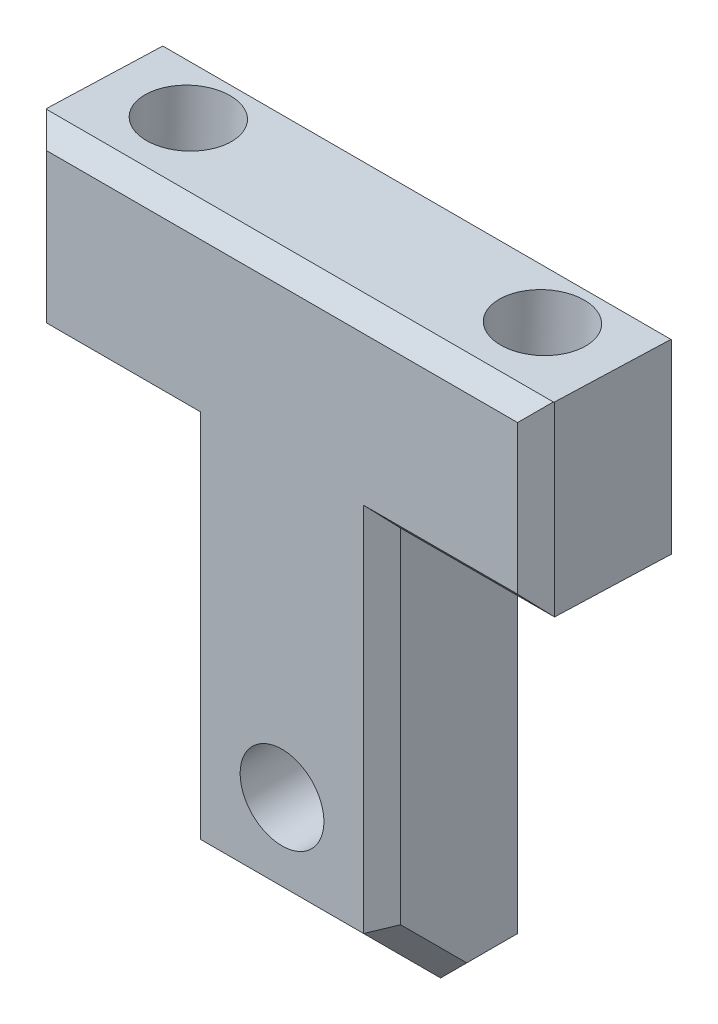
ISO-10303-21;
HEADER;
FILE_DESCRIPTION(('STEP AP214'),'2;1');
FILE_NAME('part.step','',(''),(''),'','','');
FILE_SCHEMA(('AUTOMOTIVE_DESIGN { 1 0 10303 214 1 1 1 1 }'));
ENDSEC;
DATA;
#1=APPLICATION_CONTEXT('core data for automotive mechanical design processes');
#2=APPLICATION_PROTOCOL_DEFINITION('international standard','automotive_design',2000,#1);
#3=PRODUCT_CONTEXT('',#1,'mechanical');
#4=PRODUCT('Part','Part','',(#3));
#5=PRODUCT_RELATED_PRODUCT_CATEGORY('part','',(#4));
#6=PRODUCT_DEFINITION_FORMATION('','',#4);
#7=PRODUCT_DEFINITION_CONTEXT('part definition',#1,'design');
#8=PRODUCT_DEFINITION('design','',#6,#7);
#9=PRODUCT_DEFINITION_SHAPE('','',#8);
#10=(LENGTH_UNIT() NAMED_UNIT(*) SI_UNIT(.MILLI.,.METRE.));
#11=(NAMED_UNIT(*) PLANE_ANGLE_UNIT() SI_UNIT($,.RADIAN.));
#12=(NAMED_UNIT(*) SI_UNIT($,.STERADIAN.) SOLID_ANGLE_UNIT());
#13=UNCERTAINTY_MEASURE_WITH_UNIT(LENGTH_MEASURE(1.E-05),#10,'distance_accuracy_value','');
#14=(GEOMETRIC_REPRESENTATION_CONTEXT(3) GLOBAL_UNCERTAINTY_ASSIGNED_CONTEXT((#13)) GLOBAL_UNIT_ASSIGNED_CONTEXT((#10,
#11,#12)) REPRESENTATION_CONTEXT('',''));
#15=CARTESIAN_POINT('',(0.,0.,0.));
#16=DIRECTION('',(0.,0.,1.));
#17=DIRECTION('',(1.,0.,0.));
#18=AXIS2_PLACEMENT_3D('',#15,#16,#17);
#19=CARTESIAN_POINT('',(-53.3886087756534,-22.225,6.35));
#20=DIRECTION('',(-1.,0.,0.));
#21=DIRECTION('',(0.,0.,1.));
#22=AXIS2_PLACEMENT_3D('',#19,#20,#21);
#23=PLANE('',#22);
#24=DIRECTION('',(0.,0.0343762121290854,0.999408963357672));
#25=VECTOR('',#24,1.);
#26=CARTESIAN_POINT('',(-53.3886087756534,-4.75687203963886,0.163619947690041));
#27=LINE('',#26,#25);
#28=CARTESIAN_POINT('',(-53.3886087756534,-4.73628983518983,0.761999999999995));
#29=VERTEX_POINT('',#28);
#30=CARTESIAN_POINT('',(-53.3886087756534,-4.57029212472544,5.588));
#31=VERTEX_POINT('',#30);
#32=EDGE_CURVE('E231',#29,#31,#27,.T.);
#33=ORIENTED_EDGE('',*,*,#32,.T.);
#34=DIRECTION('',(0.,-1.,0.));
#35=VECTOR('',#34,1.);
#36=CARTESIAN_POINT('',(-53.3886087756534,-22.225,5.588));
#37=LINE('',#36,#35);
#38=CARTESIAN_POINT('',(-53.3886087756534,-18.7343692654717,5.588));
#39=VERTEX_POINT('',#38);
#40=EDGE_CURVE('E328',#31,#39,#37,.T.);
#41=ORIENTED_EDGE('',*,*,#40,.T.);
#42=DIRECTION('',(0.,-0.707106781186546,-0.707106781186549));
#43=VECTOR('',#42,1.);
#44=CARTESIAN_POINT('',(-53.3886087756534,-21.6861846327359,2.63618463273585));
#45=LINE('',#44,#43);
#46=CARTESIAN_POINT('',(-53.3886087756534,-21.463,2.8593692654717));
#47=VERTEX_POINT('',#46);
#48=EDGE_CURVE('E326',#39,#47,#45,.T.);
#49=ORIENTED_EDGE('',*,*,#48,.T.);
#50=DIRECTION('',(0.,0.,-1.));
#51=VECTOR('',#50,1.);
#52=CARTESIAN_POINT('',(-53.3886087756534,-21.463,6.35));
#53=LINE('',#52,#51);
#54=CARTESIAN_POINT('',(-53.3886087756534,-21.463,0.761999999999995));
#55=VERTEX_POINT('',#54);
#56=EDGE_CURVE('E324',#47,#55,#53,.T.);
#57=ORIENTED_EDGE('',*,*,#56,.T.);
#58=DIRECTION('',(0.,1.,0.));
#59=VECTOR('',#58,1.);
#60=CARTESIAN_POINT('',(-53.3886087756534,-4.7625,0.761999999999995));
#61=LINE('',#60,#59);
#62=EDGE_CURVE('E322',#55,#29,#61,.T.);
#63=ORIENTED_EDGE('',*,*,#62,.T.);
#64=EDGE_LOOP('',(#33,#41,#49,#57,#63));
#65=FACE_BOUND('',#64,.T.);
#66=ADVANCED_FACE('F35',(#65),#23,.F.);
#67=CARTESIAN_POINT('',(-61.6436087756534,-22.225,6.35));
#68=DIRECTION('',(1.,0.,0.));
#69=DIRECTION('',(0.,0.,-1.));
#70=AXIS2_PLACEMENT_3D('',#67,#68,#69);
#71=PLANE('',#70);
#72=DIRECTION('',(0.,0.707106781186546,0.707106781186549));
#73=VECTOR('',#72,1.);
#74=CARTESIAN_POINT('',(-61.6436087756534,-18.5111846327359,5.81118463273585));
#75=LINE('',#74,#73);
#76=CARTESIAN_POINT('',(-61.6436087756534,-21.463,2.8593692654717));
#77=VERTEX_POINT('',#76);
#78=CARTESIAN_POINT('',(-61.6436087756534,-18.7343692654717,5.588));
#79=VERTEX_POINT('',#78);
#80=EDGE_CURVE('E318',#77,#79,#75,.T.);
#81=ORIENTED_EDGE('',*,*,#80,.T.);
#82=DIRECTION('',(0.,1.,0.));
#83=VECTOR('',#82,1.);
#84=CARTESIAN_POINT('',(-61.6436087756534,-22.225,5.588));
#85=LINE('',#84,#83);
#86=CARTESIAN_POINT('',(-61.6436087756534,-4.54408195991527,5.588));
#87=VERTEX_POINT('',#86);
#88=EDGE_CURVE('E320',#79,#87,#85,.T.);
#89=ORIENTED_EDGE('',*,*,#88,.T.);
#90=DIRECTION('',(0.,0.707106781186549,0.707106781186546));
#91=VECTOR('',#90,1.);
#92=CARTESIAN_POINT('',(-61.6436087756534,-13.0035409799577,-2.87145902004236));
#93=LINE('',#92,#91);
#94=CARTESIAN_POINT('',(-61.6436087756534,-4.57122577820436,5.56085618171092));
#95=VERTEX_POINT('',#94);
#96=EDGE_CURVE('E340',#87,#95,#93,.F.);
#97=ORIENTED_EDGE('',*,*,#96,.T.);
#98=DIRECTION('',(0.,-0.0343762121290854,-0.999408963357672));
#99=VECTOR('',#98,1.);
#100=CARTESIAN_POINT('',(-61.6436087756534,-4.7625,0.));
#101=LINE('',#100,#99);
#102=CARTESIAN_POINT('',(-61.6436087756534,-4.73628983518983,0.761999999999995));
#103=VERTEX_POINT('',#102);
#104=EDGE_CURVE('E225',#95,#103,#101,.T.);
#105=ORIENTED_EDGE('',*,*,#104,.T.);
#106=DIRECTION('',(0.,-1.,0.));
#107=VECTOR('',#106,1.);
#108=CARTESIAN_POINT('',(-61.6436087756534,-22.225,0.761999999999995));
#109=LINE('',#108,#107);
#110=CARTESIAN_POINT('',(-61.6436087756534,-21.463,0.761999999999995));
#111=VERTEX_POINT('',#110);
#112=EDGE_CURVE('E314',#103,#111,#109,.T.);
#113=ORIENTED_EDGE('',*,*,#112,.T.);
#114=DIRECTION('',(0.,0.,1.));
#115=VECTOR('',#114,1.);
#116=CARTESIAN_POINT('',(-61.6436087756534,-21.463,6.35));
#117=LINE('',#116,#115);
#118=EDGE_CURVE('E316',#111,#77,#117,.T.);
#119=ORIENTED_EDGE('',*,*,#118,.T.);
#120=EDGE_LOOP('',(#81,#89,#97,#105,#113,#119));
#121=FACE_BOUND('',#120,.T.);
#122=ADVANCED_FACE('F512',(#121),#71,.F.);
#123=CARTESIAN_POINT('',(-61.6436087756534,-22.225,6.35));
#124=DIRECTION('',(0.,1.,0.));
#125=DIRECTION('',(0.,0.,1.));
#126=AXIS2_PLACEMENT_3D('',#123,#124,#125);
#127=PLANE('',#126);
#128=DIRECTION('',(1.,0.,0.));
#129=VECTOR('',#128,1.);
#130=CARTESIAN_POINT('',(-53.3886087756534,-22.225,0.761999999999995));
#131=LINE('',#130,#129);
#132=CARTESIAN_POINT('',(-60.8816087756534,-22.225,0.761999999999995));
#133=VERTEX_POINT('',#132);
#134=CARTESIAN_POINT('',(-54.1506087756534,-22.225,0.761999999999995));
#135=VERTEX_POINT('',#134);
#136=EDGE_CURVE('E334',#133,#135,#131,.T.);
#137=ORIENTED_EDGE('',*,*,#136,.T.);
#138=DIRECTION('',(0.,0.,1.));
#139=VECTOR('',#138,1.);
#140=CARTESIAN_POINT('',(-54.1506087756534,-22.225,6.35));
#141=LINE('',#140,#139);
#142=CARTESIAN_POINT('',(-54.1506087756534,-22.225,3.17499999999999));
#143=VERTEX_POINT('',#142);
#144=EDGE_CURVE('E338',#135,#143,#141,.T.);
#145=ORIENTED_EDGE('',*,*,#144,.T.);
#146=DIRECTION('',(-1.,0.,0.));
#147=VECTOR('',#146,1.);
#148=CARTESIAN_POINT('',(-61.6436087756534,-22.225,3.17499999999999));
#149=LINE('',#148,#147);
#150=CARTESIAN_POINT('',(-60.8816087756534,-22.225,3.17499999999999));
#151=VERTEX_POINT('',#150);
#152=EDGE_CURVE('E253',#143,#151,#149,.T.);
#153=ORIENTED_EDGE('',*,*,#152,.T.);
#154=DIRECTION('',(0.,0.,-1.));
#155=VECTOR('',#154,1.);
#156=CARTESIAN_POINT('',(-60.8816087756534,-22.225,6.35));
#157=LINE('',#156,#155);
#158=EDGE_CURVE('E336',#151,#133,#157,.T.);
#159=ORIENTED_EDGE('',*,*,#158,.T.);
#160=EDGE_LOOP('',(#137,#145,#153,#159));
#161=FACE_BOUND('',#160,.T.);
#162=ADVANCED_FACE('F522',(#161),#127,.F.);
#163=CARTESIAN_POINT('',(0.,0.,6.35));
#164=DIRECTION('',(0.,0.,-1.));
#165=DIRECTION('',(-1.,0.,0.));
#166=AXIS2_PLACEMENT_3D('',#163,#164,#165);
#167=PLANE('',#166);
#168=CARTESIAN_POINT('',(-57.5161087756534,-15.8749999999998,6.35));
#169=DIRECTION('',(0.,0.,-1.));
#170=DIRECTION('',(-1.,0.,0.));
#171=AXIS2_PLACEMENT_3D('',#168,#169,#170);
#172=CIRCLE('',#171,1.7272);
#173=CARTESIAN_POINT('',(-59.2433087756534,-15.8749999999998,6.35));
#174=VERTEX_POINT('',#173);
#175=EDGE_CURVE('E249',#174,#174,#172,.T.);
#176=ORIENTED_EDGE('',*,*,#175,.T.);
#177=EDGE_LOOP('',(#176));
#178=FACE_BOUND('',#177,.T.);
#179=DIRECTION('',(1.,0.,0.));
#180=VECTOR('',#179,1.);
#181=CARTESIAN_POINT('',(0.,-3.78208195991527,6.35));
#182=LINE('',#181,#180);
#183=CARTESIAN_POINT('',(-67.2316087756534,-3.78208195991527,6.35));
#184=VERTEX_POINT('',#183);
#185=CARTESIAN_POINT('',(-60.8816087756534,-3.78208195991527,6.35));
#186=VERTEX_POINT('',#185);
#187=EDGE_CURVE('E271',#184,#186,#182,.T.);
#188=ORIENTED_EDGE('',*,*,#187,.T.);
#189=DIRECTION('',(0.,-1.,0.));
#190=VECTOR('',#189,1.);
#191=CARTESIAN_POINT('',(-60.8816087756534,0.,6.35));
#192=LINE('',#191,#190);
#193=CARTESIAN_POINT('',(-60.8816087756534,-19.05,6.35));
#194=VERTEX_POINT('',#193);
#195=EDGE_CURVE('E274',#186,#194,#192,.T.);
#196=ORIENTED_EDGE('',*,*,#195,.T.);
#197=DIRECTION('',(1.,0.,0.));
#198=VECTOR('',#197,1.);
#199=CARTESIAN_POINT('',(0.,-19.05,6.35));
#200=LINE('',#199,#198);
#201=CARTESIAN_POINT('',(-54.1506087756534,-19.05,6.35));
#202=VERTEX_POINT('',#201);
#203=EDGE_CURVE('E243',#194,#202,#200,.T.);
#204=ORIENTED_EDGE('',*,*,#203,.T.);
#205=DIRECTION('',(0.,1.,0.));
#206=VECTOR('',#205,1.);
#207=CARTESIAN_POINT('',(-54.1506087756534,0.,6.35));
#208=LINE('',#207,#206);
#209=CARTESIAN_POINT('',(-54.1506087756534,-3.75447145288337,6.35));
#210=VERTEX_POINT('',#209);
#211=EDGE_CURVE('E216',#202,#210,#208,.T.);
#212=ORIENTED_EDGE('',*,*,#211,.T.);
#213=DIRECTION('',(1.,0.,0.));
#214=VECTOR('',#213,1.);
#215=CARTESIAN_POINT('',(0.,-3.75447145288337,6.35));
#216=LINE('',#215,#214);
#217=CARTESIAN_POINT('',(-47.8006087756535,-3.75447145288337,6.35));
#218=VERTEX_POINT('',#217);
#219=EDGE_CURVE('E263',#210,#218,#216,.T.);
#220=ORIENTED_EDGE('',*,*,#219,.T.);
#221=DIRECTION('',(0.,1.,0.));
#222=VECTOR('',#221,1.);
#223=CARTESIAN_POINT('',(-47.8006087756535,3.135241634,6.35));
#224=LINE('',#223,#222);
#225=CARTESIAN_POINT('',(-47.8006087756535,2.37324163399999,6.35));
#226=VERTEX_POINT('',#225);
#227=EDGE_CURVE('E265',#218,#226,#224,.T.);
#228=ORIENTED_EDGE('',*,*,#227,.T.);
#229=DIRECTION('',(-1.,0.,0.));
#230=VECTOR('',#229,1.);
#231=CARTESIAN_POINT('',(0.,2.37324163399999,6.35));
#232=LINE('',#231,#230);
#233=CARTESIAN_POINT('',(-67.2316087756534,2.37324163399999,6.35));
#234=VERTEX_POINT('',#233);
#235=EDGE_CURVE('E267',#226,#234,#232,.T.);
#236=ORIENTED_EDGE('',*,*,#235,.T.);
#237=DIRECTION('',(0.,-1.,0.));
#238=VECTOR('',#237,1.);
#239=CARTESIAN_POINT('',(-67.2316087756534,0.,6.35));
#240=LINE('',#239,#238);
#241=EDGE_CURVE('E269',#234,#184,#240,.T.);
#242=ORIENTED_EDGE('',*,*,#241,.T.);
#243=EDGE_LOOP('',(#188,#196,#204,#212,#220,#228,#236,#242));
#244=FACE_BOUND('',#243,.T.);
#245=ADVANCED_FACE('F495',(#178,#244),#167,.F.);
#246=CARTESIAN_POINT('',(0.,0.,0.));
#247=DIRECTION('',(0.,0.,-1.));
#248=DIRECTION('',(-1.,0.,0.));
#249=AXIS2_PLACEMENT_3D('',#246,#247,#248);
#250=PLANE('',#249);
#251=DIRECTION('',(0.,-1.,0.));
#252=VECTOR('',#251,1.);
#253=CARTESIAN_POINT('',(-47.8006087756534,0.,0.));
#254=LINE('',#253,#252);
#255=CARTESIAN_POINT('',(-47.8006087756534,2.15482359391527,0.));
#256=VERTEX_POINT('',#255);
#257=CARTESIAN_POINT('',(-47.8006087756534,-4.02540295308093,0.));
#258=VERTEX_POINT('',#257);
#259=EDGE_CURVE('E309',#256,#258,#254,.T.);
#260=ORIENTED_EDGE('',*,*,#259,.T.);
#261=DIRECTION('',(-1.,0.,0.));
#262=VECTOR('',#261,1.);
#263=CARTESIAN_POINT('',(-53.3886087756534,-4.02540295308093,0.));
#264=LINE('',#263,#262);
#265=CARTESIAN_POINT('',(-54.1506087756534,-4.02540295308093,0.));
#266=VERTEX_POINT('',#265);
#267=EDGE_CURVE('E311',#258,#266,#264,.T.);
#268=ORIENTED_EDGE('',*,*,#267,.T.);
#269=DIRECTION('',(0.,-1.,0.));
#270=VECTOR('',#269,1.);
#271=CARTESIAN_POINT('',(-54.1506087756534,-22.225,0.));
#272=LINE('',#271,#270);
#273=CARTESIAN_POINT('',(-54.1506087756534,-21.463,0.));
#274=VERTEX_POINT('',#273);
#275=EDGE_CURVE('E301',#266,#274,#272,.T.);
#276=ORIENTED_EDGE('',*,*,#275,.T.);
#277=DIRECTION('',(-1.,0.,0.));
#278=VECTOR('',#277,1.);
#279=CARTESIAN_POINT('',(-61.6436087756534,-21.463,0.));
#280=LINE('',#279,#278);
#281=CARTESIAN_POINT('',(-60.8816087756534,-21.463,0.));
#282=VERTEX_POINT('',#281);
#283=EDGE_CURVE('E299',#274,#282,#280,.T.);
#284=ORIENTED_EDGE('',*,*,#283,.T.);
#285=DIRECTION('',(0.,1.,0.));
#286=VECTOR('',#285,1.);
#287=CARTESIAN_POINT('',(-60.8816087756534,-4.7625,0.));
#288=LINE('',#287,#286);
#289=CARTESIAN_POINT('',(-60.8816087756534,-4.0005,0.));
#290=VERTEX_POINT('',#289);
#291=EDGE_CURVE('E297',#282,#290,#288,.T.);
#292=ORIENTED_EDGE('',*,*,#291,.T.);
#293=DIRECTION('',(-1.,0.,0.));
#294=VECTOR('',#293,1.);
#295=CARTESIAN_POINT('',(-67.9936087756534,-4.0005,0.));
#296=LINE('',#295,#294);
#297=CARTESIAN_POINT('',(-67.2316087756534,-4.0005,0.));
#298=VERTEX_POINT('',#297);
#299=EDGE_CURVE('E303',#290,#298,#296,.T.);
#300=ORIENTED_EDGE('',*,*,#299,.T.);
#301=DIRECTION('',(0.,1.,0.));
#302=VECTOR('',#301,1.);
#303=CARTESIAN_POINT('',(-67.2316087756534,2.91682359391527,0.));
#304=LINE('',#303,#302);
#305=CARTESIAN_POINT('',(-67.2316087756534,2.15482359391527,0.));
#306=VERTEX_POINT('',#305);
#307=EDGE_CURVE('E305',#298,#306,#304,.T.);
#308=ORIENTED_EDGE('',*,*,#307,.T.);
#309=DIRECTION('',(1.,0.,0.));
#310=VECTOR('',#309,1.);
#311=CARTESIAN_POINT('',(-47.0386087756534,2.15482359391527,0.));
#312=LINE('',#311,#310);
#313=EDGE_CURVE('E307',#306,#256,#312,.T.);
#314=ORIENTED_EDGE('',*,*,#313,.T.);
#315=EDGE_LOOP('',(#260,#268,#276,#284,#292,#300,#308,#314));
#316=FACE_BOUND('',#315,.T.);
#317=CARTESIAN_POINT('',(-57.5161087756534,-15.8749999999998,0.));
#318=DIRECTION('',(0.,0.,-1.));
#319=DIRECTION('',(-1.,0.,0.));
#320=AXIS2_PLACEMENT_3D('',#317,#318,#319);
#321=CIRCLE('',#320,2.07010000000001);
#322=CARTESIAN_POINT('',(-59.5862087756534,-15.8749999999998,0.));
#323=VERTEX_POINT('',#322);
#324=EDGE_CURVE('E407',#323,#323,#321,.T.);
#325=ORIENTED_EDGE('',*,*,#324,.F.);
#326=EDGE_LOOP('',(#325));
#327=FACE_BOUND('',#326,.T.);
#328=ADVANCED_FACE('F535',(#316,#327),#250,.T.);
#329=CARTESIAN_POINT('',(-67.9936087756534,0.,0.));
#330=DIRECTION('',(1.,0.,0.));
#331=DIRECTION('',(0.,0.,-1.));
#332=AXIS2_PLACEMENT_3D('',#329,#330,#331);
#333=PLANE('',#332);
#334=DIRECTION('',(0.,-0.0343762121290854,-0.999408963357672));
#335=VECTOR('',#334,1.);
#336=CARTESIAN_POINT('',(-67.9936087756534,-4.7625,0.));
#337=LINE('',#336,#335);
#338=CARTESIAN_POINT('',(-67.9936087756534,-4.57122577820436,5.56085618171092));
#339=VERTEX_POINT('',#338);
#340=CARTESIAN_POINT('',(-67.9936087756534,-4.73628983518983,0.762000000000006));
#341=VERTEX_POINT('',#340);
#342=EDGE_CURVE('E222',#339,#341,#337,.T.);
#343=ORIENTED_EDGE('',*,*,#342,.F.);
#344=DIRECTION('',(0.,-0.707106781186549,-0.707106781186546));
#345=VECTOR('',#344,1.);
#346=CARTESIAN_POINT('',(-67.9936087756534,-4.57122577820436,5.56085618171092));
#347=LINE('',#346,#345);
#348=CARTESIAN_POINT('',(-67.9936087756534,-4.54408195991528,5.58799999999999));
#349=VERTEX_POINT('',#348);
#350=EDGE_CURVE('E205',#339,#349,#347,.F.);
#351=ORIENTED_EDGE('',*,*,#350,.T.);
#352=DIRECTION('',(0.,1.,0.));
#353=VECTOR('',#352,1.);
#354=CARTESIAN_POINT('',(-67.9936087756534,0.,5.58799999999999));
#355=LINE('',#354,#353);
#356=CARTESIAN_POINT('',(-67.9936087756534,3.10903146918983,5.58799999999999));
#357=VERTEX_POINT('',#356);
#358=EDGE_CURVE('E217',#349,#357,#355,.T.);
#359=ORIENTED_EDGE('',*,*,#358,.T.);
#360=DIRECTION('',(0.,0.0343762121290853,0.999408963357672));
#361=VECTOR('',#360,1.);
#362=CARTESIAN_POINT('',(-67.9936087756534,2.91682359391527,0.));
#363=LINE('',#362,#361);
#364=CARTESIAN_POINT('',(-67.9936087756534,2.94396741220436,0.789143818289088));
#365=VERTEX_POINT('',#364);
#366=EDGE_CURVE('E233',#365,#357,#363,.T.);
#367=ORIENTED_EDGE('',*,*,#366,.F.);
#368=DIRECTION('',(0.,-0.707106781186548,-0.707106781186547));
#369=VECTOR('',#368,1.);
#370=CARTESIAN_POINT('',(-67.9936087756534,2.94396741220436,0.789143818289088));
#371=LINE('',#370,#369);
#372=CARTESIAN_POINT('',(-67.9936087756534,2.91682359391527,0.762000000000006));
#373=VERTEX_POINT('',#372);
#374=EDGE_CURVE('E259',#365,#373,#371,.T.);
#375=ORIENTED_EDGE('',*,*,#374,.T.);
#376=DIRECTION('',(0.,-1.,0.));
#377=VECTOR('',#376,1.);
#378=CARTESIAN_POINT('',(-67.9936087756534,-4.7625,0.762000000000006));
#379=LINE('',#378,#377);
#380=EDGE_CURVE('E226',#373,#341,#379,.T.);
#381=ORIENTED_EDGE('',*,*,#380,.T.);
#382=EDGE_LOOP('',(#343,#351,#359,#367,#375,#381));
#383=FACE_BOUND('',#382,.T.);
#384=ADVANCED_FACE('F229',(#383),#333,.F.);
#385=CARTESIAN_POINT('',(-47.0386087756534,0.,0.));
#386=DIRECTION('',(1.,0.,0.));
#387=DIRECTION('',(0.,0.,-1.));
#388=AXIS2_PLACEMENT_3D('',#385,#386,#387);
#389=PLANE('',#388);
#390=DIRECTION('',(0.,0.0343762121290853,0.999408963357672));
#391=VECTOR('',#390,1.);
#392=CARTESIAN_POINT('',(-47.0386087756534,2.91682359391527,0.));
#393=LINE('',#392,#391);
#394=CARTESIAN_POINT('',(-47.0386087756534,2.94396741220436,0.789143818289088));
#395=VERTEX_POINT('',#394);
#396=CARTESIAN_POINT('',(-47.0386087756534,3.10903146918983,5.58799999999999));
#397=VERTEX_POINT('',#396);
#398=EDGE_CURVE('E240',#395,#397,#393,.T.);
#399=ORIENTED_EDGE('',*,*,#398,.T.);
#400=DIRECTION('',(0.,-1.,0.));
#401=VECTOR('',#400,1.);
#402=CARTESIAN_POINT('',(-47.0386087756534,-4.54408195991527,5.58799999999999));
#403=LINE('',#402,#401);
#404=CARTESIAN_POINT('',(-47.0386087756534,-4.57029212472544,5.58799999999999));
#405=VERTEX_POINT('',#404);
#406=EDGE_CURVE('E288',#397,#405,#403,.T.);
#407=ORIENTED_EDGE('',*,*,#406,.T.);
#408=DIRECTION('',(0.,0.0343762121290854,0.999408963357672));
#409=VECTOR('',#408,1.);
#410=CARTESIAN_POINT('',(-47.0386087756534,-4.75687203963886,0.163619947690041));
#411=LINE('',#410,#409);
#412=CARTESIAN_POINT('',(-47.0386087756534,-4.73628983518983,0.761999999999999));
#413=VERTEX_POINT('',#412);
#414=EDGE_CURVE('E236',#413,#405,#411,.T.);
#415=ORIENTED_EDGE('',*,*,#414,.F.);
#416=DIRECTION('',(0.,1.,0.));
#417=VECTOR('',#416,1.);
#418=CARTESIAN_POINT('',(-47.0386087756534,0.,0.761999999999999));
#419=LINE('',#418,#417);
#420=CARTESIAN_POINT('',(-47.0386087756534,2.91682359391527,0.761999999999999));
#421=VERTEX_POINT('',#420);
#422=EDGE_CURVE('E286',#413,#421,#419,.T.);
#423=ORIENTED_EDGE('',*,*,#422,.T.);
#424=DIRECTION('',(0.,0.707106781186548,0.707106781186547));
#425=VECTOR('',#424,1.);
#426=CARTESIAN_POINT('',(-47.0386087756534,1.07741179695763,-1.07741179695763));
#427=LINE('',#426,#425);
#428=EDGE_CURVE('E284',#421,#395,#427,.T.);
#429=ORIENTED_EDGE('',*,*,#428,.T.);
#430=EDGE_LOOP('',(#399,#407,#415,#423,#429));
#431=FACE_BOUND('',#430,.T.);
#432=ADVANCED_FACE('F476',(#431),#389,.T.);
#433=CARTESIAN_POINT('',(-47.0386087756534,2.91682359391527,0.));
#434=DIRECTION('',(0.,-0.999408963357672,0.0343762121290853));
#435=DIRECTION('',(0.,-0.0343762121290853,-0.999408963357672));
#436=AXIS2_PLACEMENT_3D('',#433,#434,#435);
#437=PLANE('',#436);
#438=CARTESIAN_POINT('',(-64.8186087756534,3.01695777326747,2.91116996856036));
#439=DIRECTION('',(0.,-0.999408963357672,0.0343762121290853));
#440=DIRECTION('',(0.,-0.0343762121290853,-0.999408963357672));
#441=AXIS2_PLACEMENT_3D('',#438,#439,#440);
#442=CIRCLE('',#441,1.72719999999999);
#443=CARTESIAN_POINT('',(-64.8186087756534,2.95758317967812,1.18499080704899));
#444=VERTEX_POINT('',#443);
#445=EDGE_CURVE('E422',#444,#444,#442,.T.);
#446=ORIENTED_EDGE('',*,*,#445,.T.);
#447=EDGE_LOOP('',(#446));
#448=FACE_BOUND('',#447,.T.);
#449=CARTESIAN_POINT('',(-50.2136087756534,3.01695777326747,2.91116996856035));
#450=DIRECTION('',(0.,-0.999408963357672,0.0343762121290853));
#451=DIRECTION('',(0.,-0.0343762121290853,-0.999408963357672));
#452=AXIS2_PLACEMENT_3D('',#449,#450,#451);
#453=CIRCLE('',#452,1.72719999999999);
#454=CARTESIAN_POINT('',(-50.2136087756534,2.95758317967812,1.18499080704899));
#455=VERTEX_POINT('',#454);
#456=EDGE_CURVE('E428',#455,#455,#453,.T.);
#457=ORIENTED_EDGE('',*,*,#456,.T.);
#458=EDGE_LOOP('',(#457));
#459=FACE_BOUND('',#458,.T.);
#460=ORIENTED_EDGE('',*,*,#366,.T.);
#461=DIRECTION('',(-0.706897725521718,-0.0243148371257959,-0.706897725521711));
#462=VECTOR('',#461,1.);
#463=CARTESIAN_POINT('',(-68.0470471289647,3.10719337463934,5.53456164668874));
#464=LINE('',#463,#462);
#465=CARTESIAN_POINT('',(-67.9682701712088,3.10990302955539,5.61333860444461));
#466=VERTEX_POINT('',#465);
#467=EDGE_CURVE('E282',#357,#466,#464,.F.);
#468=ORIENTED_EDGE('',*,*,#467,.T.);
#469=DIRECTION('',(1.,0.,0.));
#470=VECTOR('',#469,1.);
#471=CARTESIAN_POINT('',(-47.0386087756534,3.10990302955539,5.61333860444461));
#472=LINE('',#471,#470);
#473=CARTESIAN_POINT('',(-47.0639473800981,3.10990302955539,5.61333860444461));
#474=VERTEX_POINT('',#473);
#475=EDGE_CURVE('E280',#466,#474,#472,.T.);
#476=ORIENTED_EDGE('',*,*,#475,.T.);
#477=DIRECTION('',(0.706897725521716,-0.0243148371257959,-0.706897725521713));
#478=VECTOR('',#477,1.);
#479=CARTESIAN_POINT('',(-46.9851704223422,3.10719337463934,5.53456164668873));
#480=LINE('',#479,#478);
#481=EDGE_CURVE('E278',#474,#397,#480,.T.);
#482=ORIENTED_EDGE('',*,*,#481,.T.);
#483=ORIENTED_EDGE('',*,*,#398,.F.);
#484=DIRECTION('',(-1.,0.,0.));
#485=VECTOR('',#484,1.);
#486=CARTESIAN_POINT('',(-67.9936087756534,2.94396741220436,0.789143818289088));
#487=LINE('',#486,#485);
#488=EDGE_CURVE('E276',#395,#365,#487,.T.);
#489=ORIENTED_EDGE('',*,*,#488,.T.);
#490=EDGE_LOOP('',(#460,#468,#476,#482,#483,#489));
#491=FACE_BOUND('',#490,.T.);
#492=ADVANCED_FACE('F480',(#448,#459,#491),#437,.F.);
#493=CARTESIAN_POINT('',(-55.2898534734534,-4.7625,0.));
#494=DIRECTION('',(0.,0.999408963357672,-0.0343762121290854));
#495=DIRECTION('',(0.,0.0343762121290854,0.999408963357672));
#496=AXIS2_PLACEMENT_3D('',#493,#494,#495);
#497=PLANE('',#496);
#498=CARTESIAN_POINT('',(-64.8186087756534,-4.65329097995764,3.175));
#499=DIRECTION('',(0.,-0.999408963357672,0.0343762121290854));
#500=DIRECTION('',(0.,-0.0343762121290854,-0.999408963357672));
#501=AXIS2_PLACEMENT_3D('',#498,#499,#500);
#502=CIRCLE('',#501,1.72719999999998);
#503=CARTESIAN_POINT('',(-64.8186087756534,-4.712665573547,1.44882083848865));
#504=VERTEX_POINT('',#503);
#505=EDGE_CURVE('E419',#504,#504,#502,.T.);
#506=ORIENTED_EDGE('',*,*,#505,.F.);
#507=EDGE_LOOP('',(#506));
#508=FACE_BOUND('',#507,.T.);
#509=ORIENTED_EDGE('',*,*,#104,.F.);
#510=DIRECTION('',(-1.,0.,0.));
#511=VECTOR('',#510,1.);
#512=CARTESIAN_POINT('',(-55.2898534734534,-4.57122577820436,5.56085618171092));
#513=LINE('',#512,#511);
#514=EDGE_CURVE('E209',#95,#339,#513,.T.);
#515=ORIENTED_EDGE('',*,*,#514,.T.);
#516=ORIENTED_EDGE('',*,*,#342,.T.);
#517=DIRECTION('',(0.706897725521718,-0.0243148371257959,-0.706897725521711));
#518=VECTOR('',#517,1.);
#519=CARTESIAN_POINT('',(-68.0750166134658,-4.7334896870981,0.843407837812386));
#520=LINE('',#519,#518);
#521=CARTESIAN_POINT('',(-67.9682701712088,-4.73716139555539,0.736661395555387));
#522=VERTEX_POINT('',#521);
#523=EDGE_CURVE('E227',#341,#522,#520,.T.);
#524=ORIENTED_EDGE('',*,*,#523,.T.);
#525=DIRECTION('',(1.,0.,0.));
#526=VECTOR('',#525,1.);
#527=CARTESIAN_POINT('',(-61.6436087756534,-4.73716139555539,0.736661395555387));
#528=LINE('',#527,#526);
#529=CARTESIAN_POINT('',(-61.6182701712088,-4.73716139555539,0.736661395555387));
#530=VERTEX_POINT('',#529);
#531=EDGE_CURVE('E52',#522,#530,#528,.T.);
#532=ORIENTED_EDGE('',*,*,#531,.T.);
#533=DIRECTION('',(-0.706897725521716,0.024314837125796,0.706897725521713));
#534=VECTOR('',#533,1.);
#535=CARTESIAN_POINT('',(-58.0873840790266,-4.85861166642418,-2.7942246966268));
#536=LINE('',#535,#534);
#537=EDGE_CURVE('E11',#530,#103,#536,.T.);
#538=ORIENTED_EDGE('',*,*,#537,.T.);
#539=EDGE_LOOP('',(#509,#515,#516,#524,#532,#538));
#540=FACE_BOUND('',#539,.T.);
#541=ADVANCED_FACE('F221',(#508,#540),#497,.F.);
#542=CARTESIAN_POINT('',(-59.7423640778534,-4.75687203963886,0.163619947690041));
#543=DIRECTION('',(0.,0.999408963357672,-0.0343762121290854));
#544=DIRECTION('',(0.,0.0343762121290854,0.999408963357672));
#545=AXIS2_PLACEMENT_3D('',#542,#543,#544);
#546=PLANE('',#545);
#547=CARTESIAN_POINT('',(-50.2136087756534,-4.65329097995764,3.175));
#548=DIRECTION('',(0.,-0.999408963357672,0.0343762121290854));
#549=DIRECTION('',(0.,-0.0343762121290854,-0.999408963357672));
#550=AXIS2_PLACEMENT_3D('',#547,#548,#549);
#551=CIRCLE('',#550,1.72719999999998);
#552=CARTESIAN_POINT('',(-50.2136087756534,-4.712665573547,1.44882083848865));
#553=VERTEX_POINT('',#552);
#554=EDGE_CURVE('E425',#553,#553,#551,.T.);
#555=ORIENTED_EDGE('',*,*,#554,.F.);
#556=EDGE_LOOP('',(#555));
#557=FACE_BOUND('',#556,.T.);
#558=ORIENTED_EDGE('',*,*,#414,.T.);
#559=DIRECTION('',(-0.706897725521716,0.024314837125796,0.706897725521713));
#560=VECTOR('',#559,1.);
#561=CARTESIAN_POINT('',(-47.1171634277105,-4.56759011635665,5.66655465205708));
#562=LINE('',#561,#560);
#563=CARTESIAN_POINT('',(-47.0390591455749,-4.57027663355764,5.58845036992146));
#564=VERTEX_POINT('',#563);
#565=EDGE_CURVE('E295',#405,#564,#562,.T.);
#566=ORIENTED_EDGE('',*,*,#565,.T.);
#567=DIRECTION('',(-1.,0.,0.));
#568=VECTOR('',#567,1.);
#569=CARTESIAN_POINT('',(-59.7423640778534,-4.57027663355764,5.58845036992146));
#570=LINE('',#569,#568);
#571=CARTESIAN_POINT('',(-53.3890591455749,-4.57027663355764,5.58845036992145));
#572=VERTEX_POINT('',#571);
#573=EDGE_CURVE('E293',#564,#572,#570,.T.);
#574=ORIENTED_EDGE('',*,*,#573,.T.);
#575=DIRECTION('',(-0.706897725521711,0.0243148371257961,0.706897725521718));
#576=VECTOR('',#575,1.);
#577=CARTESIAN_POINT('',(-53.8498147172149,-4.55442823530319,6.0492059415615));
#578=LINE('',#577,#576);
#579=EDGE_CURVE('E342',#572,#31,#578,.F.);
#580=ORIENTED_EDGE('',*,*,#579,.T.);
#581=ORIENTED_EDGE('',*,*,#32,.F.);
#582=DIRECTION('',(-0.706897725521716,-0.024314837125796,-0.706897725521713));
#583=VECTOR('',#582,1.);
#584=CARTESIAN_POINT('',(-56.8629751314539,-4.85579602258672,-2.71236635580042));
#585=LINE('',#584,#583);
#586=CARTESIAN_POINT('',(-53.3890591455749,-4.73630532635764,0.761549630078549));
#587=VERTEX_POINT('',#586);
#588=EDGE_CURVE('E45',#29,#587,#585,.T.);
#589=ORIENTED_EDGE('',*,*,#588,.T.);
#590=DIRECTION('',(1.,0.,0.));
#591=VECTOR('',#590,1.);
#592=CARTESIAN_POINT('',(-47.0386087756534,-4.73630532635764,0.761549630078549));
#593=LINE('',#592,#591);
#594=CARTESIAN_POINT('',(-47.0390591455749,-4.73630532635764,0.761549630078549));
#595=VERTEX_POINT('',#594);
#596=EDGE_CURVE('E60',#587,#595,#593,.T.);
#597=ORIENTED_EDGE('',*,*,#596,.T.);
#598=DIRECTION('',(-0.706897725521714,-0.024314837125796,-0.706897725521714));
#599=VECTOR('',#598,1.);
#600=CARTESIAN_POINT('',(-47.7187504348271,-4.75968435616254,0.0818583408263749));
#601=LINE('',#600,#599);
#602=EDGE_CURVE('E290',#595,#413,#601,.F.);
#603=ORIENTED_EDGE('',*,*,#602,.T.);
#604=EDGE_LOOP('',(#558,#566,#574,#580,#581,#589,#597,#603));
#605=FACE_BOUND('',#604,.T.);
#606=ADVANCED_FACE('F434',(#557,#605),#546,.F.);
#607=CARTESIAN_POINT('',(-50.2136087756534,-4.65329097995764,3.175));
#608=DIRECTION('',(0.,-0.999408963357672,0.0343762121290854));
#609=DIRECTION('',(0.,-0.0343762121290854,-0.999408963357672));
#610=AXIS2_PLACEMENT_3D('',#607,#608,#609);
#611=CYLINDRICAL_SURFACE('',#610,1.72719999999999);
#612=ORIENTED_EDGE('',*,*,#554,.T.);
#613=EDGE_LOOP('',(#612));
#614=FACE_BOUND('',#613,.T.);
#615=ORIENTED_EDGE('',*,*,#456,.F.);
#616=EDGE_LOOP('',(#615));
#617=FACE_BOUND('',#616,.T.);
#618=ADVANCED_FACE('F828',(#614,#617),#611,.F.);
#619=CARTESIAN_POINT('',(-64.8186087756534,-4.65329097995764,3.175));
#620=DIRECTION('',(0.,-0.999408963357672,0.0343762121290854));
#621=DIRECTION('',(0.,-0.0343762121290854,-0.999408963357672));
#622=AXIS2_PLACEMENT_3D('',#619,#620,#621);
#623=CYLINDRICAL_SURFACE('',#622,1.72719999999999);
#624=ORIENTED_EDGE('',*,*,#505,.T.);
#625=EDGE_LOOP('',(#624));
#626=FACE_BOUND('',#625,.T.);
#627=ORIENTED_EDGE('',*,*,#445,.F.);
#628=EDGE_LOOP('',(#627));
#629=FACE_BOUND('',#628,.T.);
#630=ADVANCED_FACE('F819',(#626,#629),#623,.F.);
#631=CARTESIAN_POINT('',(-57.5161087756534,-15.8749999999998,0.));
#632=DIRECTION('',(0.,0.,-1.));
#633=DIRECTION('',(-1.,0.,0.));
#634=AXIS2_PLACEMENT_3D('',#631,#632,#633);
#635=CYLINDRICAL_SURFACE('',#634,1.72719999999999);
#636=CARTESIAN_POINT('',(-57.5161087756534,-15.8749999999998,3.429));
#637=DIRECTION('',(0.,0.,1.));
#638=DIRECTION('',(1.,0.,0.));
#639=AXIS2_PLACEMENT_3D('',#636,#637,#638);
#640=CIRCLE('',#639,1.72719999999999);
#641=CARTESIAN_POINT('',(-55.7889087756534,-15.8749999999998,3.429));
#642=VERTEX_POINT('',#641);
#643=EDGE_CURVE('E246',#642,#642,#640,.F.);
#644=ORIENTED_EDGE('',*,*,#643,.T.);
#645=EDGE_LOOP('',(#644));
#646=FACE_BOUND('',#645,.T.);
#647=ORIENTED_EDGE('',*,*,#175,.F.);
#648=EDGE_LOOP('',(#647));
#649=FACE_BOUND('',#648,.T.);
#650=ADVANCED_FACE('F810',(#646,#649),#635,.F.);
#651=CARTESIAN_POINT('',(-57.5161087756534,-15.8749999999998,3.429));
#652=DIRECTION('',(0.,0.,1.));
#653=DIRECTION('',(1.,0.,0.));
#654=AXIS2_PLACEMENT_3D('',#651,#652,#653);
#655=PLANE('',#654);
#656=CARTESIAN_POINT('',(-57.5161087756534,-15.8749999999998,3.429));
#657=DIRECTION('',(0.,0.,-1.));
#658=DIRECTION('',(-1.,0.,0.));
#659=AXIS2_PLACEMENT_3D('',#656,#657,#658);
#660=CIRCLE('',#659,1.94310000000001);
#661=CARTESIAN_POINT('',(-59.4592087756534,-15.8749999999998,3.429));
#662=VERTEX_POINT('',#661);
#663=EDGE_CURVE('E250',#662,#662,#660,.T.);
#664=ORIENTED_EDGE('',*,*,#663,.T.);
#665=EDGE_LOOP('',(#664));
#666=FACE_BOUND('',#665,.T.);
#667=ORIENTED_EDGE('',*,*,#643,.F.);
#668=EDGE_LOOP('',(#667));
#669=FACE_BOUND('',#668,.T.);
#670=ADVANCED_FACE('F801',(#666,#669),#655,.F.);
#671=CARTESIAN_POINT('',(-57.5161087756534,-15.8749999999998,0.));
#672=DIRECTION('',(0.,0.,-1.));
#673=DIRECTION('',(-1.,0.,0.));
#674=AXIS2_PLACEMENT_3D('',#671,#672,#673);
#675=CONICAL_SURFACE('',#674,2.07010000000001,0.0370201158739306);
#676=ORIENTED_EDGE('',*,*,#663,.F.);
#677=EDGE_LOOP('',(#676));
#678=FACE_BOUND('',#677,.T.);
#679=ORIENTED_EDGE('',*,*,#324,.T.);
#680=EDGE_LOOP('',(#679));
#681=FACE_BOUND('',#680,.T.);
#682=ADVANCED_FACE('F568',(#678,#681),#675,.F.);
#683=CARTESIAN_POINT('',(0.,-19.05,6.35));
#684=DIRECTION('',(0.,0.707106781186549,-0.707106781186546));
#685=DIRECTION('',(1.,0.,0.));
#686=AXIS2_PLACEMENT_3D('',#683,#684,#685);
#687=PLANE('',#686);
#688=ORIENTED_EDGE('',*,*,#152,.F.);
#689=DIRECTION('',(0.,-0.707106781186546,-0.707106781186549));
#690=VECTOR('',#689,1.);
#691=CARTESIAN_POINT('',(-54.1506087756534,-19.05,6.35));
#692=LINE('',#691,#690);
#693=EDGE_CURVE('E332',#143,#202,#692,.F.);
#694=ORIENTED_EDGE('',*,*,#693,.T.);
#695=ORIENTED_EDGE('',*,*,#203,.F.);
#696=DIRECTION('',(0.,0.707106781186546,0.707106781186549));
#697=VECTOR('',#696,1.);
#698=CARTESIAN_POINT('',(-60.8816087756534,-22.225,3.17499999999999));
#699=LINE('',#698,#697);
#700=EDGE_CURVE('E330',#194,#151,#699,.F.);
#701=ORIENTED_EDGE('',*,*,#700,.T.);
#702=EDGE_LOOP('',(#688,#694,#695,#701));
#703=FACE_BOUND('',#702,.T.);
#704=ADVANCED_FACE('F501',(#703),#687,.F.);
#705=CARTESIAN_POINT('',(-47.8006087756534,0.,0.));
#706=DIRECTION('',(-0.707106781186548,0.,0.707106781186548));
#707=DIRECTION('',(0.,-1.,0.));
#708=AXIS2_PLACEMENT_3D('',#705,#706,#707);
#709=PLANE('',#708);
#710=ORIENTED_EDGE('',*,*,#422,.F.);
#711=ORIENTED_EDGE('',*,*,#602,.F.);
#712=DIRECTION('',(0.590136190964971,-0.550888874662313,0.590136190964971));
#713=VECTOR('',#712,1.);
#714=CARTESIAN_POINT('',(-49.1092651105896,-2.80377949275081,-1.30865633493612));
#715=LINE('',#714,#713);
#716=EDGE_CURVE('E40',#258,#595,#715,.T.);
#717=ORIENTED_EDGE('',*,*,#716,.F.);
#718=ORIENTED_EDGE('',*,*,#259,.F.);
#719=DIRECTION('',(0.577350269189626,0.577350269189626,0.577350269189626));
#720=VECTOR('',#719,1.);
#721=CARTESIAN_POINT('',(-47.0205128967941,2.93491947277466,0.780095878859392));
#722=LINE('',#721,#720);
#723=EDGE_CURVE('E401',#421,#256,#722,.F.);
#724=ORIENTED_EDGE('',*,*,#723,.F.);
#725=EDGE_LOOP('',(#710,#711,#717,#718,#724));
#726=FACE_BOUND('',#725,.T.);
#727=ADVANCED_FACE('F38',(#726),#709,.F.);
#728=CARTESIAN_POINT('',(0.,-4.02540295308093,0.));
#729=DIRECTION('',(0.,-0.730996507876813,-0.682381202460842));
#730=DIRECTION('',(1.,0.,0.));
#731=AXIS2_PLACEMENT_3D('',#728,#729,#730);
#732=PLANE('',#731);
#733=ORIENTED_EDGE('',*,*,#596,.F.);
#734=DIRECTION('',(0.590136190964973,-0.550888874662312,0.59013619096497));
#735=VECTOR('',#734,1.);
#736=CARTESIAN_POINT('',(-35.2920785645417,-21.6297367405018,18.8585302111116));
#737=LINE('',#736,#735);
#738=EDGE_CURVE('E399',#266,#587,#737,.T.);
#739=ORIENTED_EDGE('',*,*,#738,.F.);
#740=ORIENTED_EDGE('',*,*,#267,.F.);
#741=ORIENTED_EDGE('',*,*,#716,.T.);
#742=EDGE_LOOP('',(#733,#739,#740,#741));
#743=FACE_BOUND('',#742,.T.);
#744=ADVANCED_FACE('F543',(#743),#732,.T.);
#745=CARTESIAN_POINT('',(-47.0386087756534,2.94396741220436,0.789143818289088));
#746=DIRECTION('',(0.,0.707106781186547,-0.707106781186548));
#747=DIRECTION('',(1.,0.,0.));
#748=AXIS2_PLACEMENT_3D('',#745,#746,#747);
#749=PLANE('',#748);
#750=ORIENTED_EDGE('',*,*,#723,.T.);
#751=ORIENTED_EDGE('',*,*,#313,.F.);
#752=DIRECTION('',(0.577350269189629,-0.577350269189624,-0.577350269189624));
#753=VECTOR('',#752,1.);
#754=CARTESIAN_POINT('',(-67.0213342443484,1.94454906261019,-0.21027453130508));
#755=LINE('',#754,#753);
#756=EDGE_CURVE('E396',#373,#306,#755,.T.);
#757=ORIENTED_EDGE('',*,*,#756,.F.);
#758=ORIENTED_EDGE('',*,*,#374,.F.);
#759=ORIENTED_EDGE('',*,*,#488,.F.);
#760=ORIENTED_EDGE('',*,*,#428,.F.);
#761=EDGE_LOOP('',(#750,#751,#757,#758,#759,#760));
#762=FACE_BOUND('',#761,.T.);
#763=ADVANCED_FACE('F483',(#762),#749,.T.);
#764=CARTESIAN_POINT('',(-53.3886087756534,-22.225,0.761999999999995));
#765=DIRECTION('',(0.707106781186546,0.,-0.707106781186549));
#766=DIRECTION('',(0.,-1.,0.));
#767=AXIS2_PLACEMENT_3D('',#764,#765,#766);
#768=PLANE('',#767);
#769=ORIENTED_EDGE('',*,*,#588,.F.);
#770=ORIENTED_EDGE('',*,*,#62,.F.);
#771=DIRECTION('',(0.707106781186549,0.,0.707106781186546));
#772=VECTOR('',#771,1.);
#773=CARTESIAN_POINT('',(-53.3886087756534,-21.463,0.761999999999995));
#774=LINE('',#773,#772);
#775=EDGE_CURVE('E390',#274,#55,#774,.T.);
#776=ORIENTED_EDGE('',*,*,#775,.F.);
#777=ORIENTED_EDGE('',*,*,#275,.F.);
#778=ORIENTED_EDGE('',*,*,#738,.T.);
#779=EDGE_LOOP('',(#769,#770,#776,#777,#778));
#780=FACE_BOUND('',#779,.T.);
#781=ADVANCED_FACE('F472',(#780),#768,.T.);
#782=CARTESIAN_POINT('',(-67.9936087756534,0.,0.762000000000006));
#783=DIRECTION('',(-0.707106781186544,0.,-0.707106781186551));
#784=DIRECTION('',(0.,1.,0.));
#785=AXIS2_PLACEMENT_3D('',#782,#783,#784);
#786=PLANE('',#785);
#787=ORIENTED_EDGE('',*,*,#756,.T.);
#788=ORIENTED_EDGE('',*,*,#307,.F.);
#789=DIRECTION('',(0.577350269189629,0.577350269189625,-0.577350269189623));
#790=VECTOR('',#789,1.);
#791=CARTESIAN_POINT('',(-63.742131271957,-0.51102249630358,-3.48947750369641));
#792=LINE('',#791,#790);
#793=EDGE_CURVE('E387',#522,#298,#792,.T.);
#794=ORIENTED_EDGE('',*,*,#793,.F.);
#795=ORIENTED_EDGE('',*,*,#523,.F.);
#796=ORIENTED_EDGE('',*,*,#380,.F.);
#797=EDGE_LOOP('',(#787,#788,#794,#795,#796));
#798=FACE_BOUND('',#797,.T.);
#799=ADVANCED_FACE('F542',(#798),#786,.T.);
#800=CARTESIAN_POINT('',(-53.3886087756534,-21.463,6.35));
#801=DIRECTION('',(-0.707106781186546,0.707106781186549,0.));
#802=DIRECTION('',(0.,0.,-1.));
#803=AXIS2_PLACEMENT_3D('',#800,#801,#802);
#804=PLANE('',#803);
#805=DIRECTION('',(0.707106781186549,0.707106781186546,0.));
#806=VECTOR('',#805,1.);
#807=CARTESIAN_POINT('',(-53.3886087756534,-21.463,0.761999999999995));
#808=LINE('',#807,#806);
#809=EDGE_CURVE('E393',#55,#135,#808,.F.);
#810=ORIENTED_EDGE('',*,*,#809,.F.);
#811=ORIENTED_EDGE('',*,*,#56,.F.);
#812=DIRECTION('',(-0.678598344545849,-0.678598344545846,0.281084637714818));
#813=VECTOR('',#812,1.);
#814=CARTESIAN_POINT('',(-54.0544241429176,-22.1288153672641,3.13515902062893));
#815=LINE('',#814,#813);
#816=EDGE_CURVE('E384',#143,#47,#815,.F.);
#817=ORIENTED_EDGE('',*,*,#816,.F.);
#818=ORIENTED_EDGE('',*,*,#144,.F.);
#819=EDGE_LOOP('',(#810,#811,#817,#818));
#820=FACE_BOUND('',#819,.T.);
#821=ADVANCED_FACE('F467',(#820),#804,.F.);
#822=CARTESIAN_POINT('',(-53.3886087756534,-21.463,0.761999999999995));
#823=DIRECTION('',(0.577350269189623,-0.577350269189626,-0.577350269189628));
#824=DIRECTION('',(0.,0.707106781186549,-0.707106781186546));
#825=AXIS2_PLACEMENT_3D('',#822,#823,#824);
#826=PLANE('',#825);
#827=ORIENTED_EDGE('',*,*,#775,.T.);
#828=ORIENTED_EDGE('',*,*,#809,.T.);
#829=DIRECTION('',(0.,0.707106781186549,-0.707106781186546));
#830=VECTOR('',#829,1.);
#831=CARTESIAN_POINT('',(-54.1506087756534,-21.844,0.380999999999998));
#832=LINE('',#831,#830);
#833=EDGE_CURVE('E381',#274,#135,#832,.F.);
#834=ORIENTED_EDGE('',*,*,#833,.F.);
#835=EDGE_LOOP('',(#827,#828,#834));
#836=FACE_BOUND('',#835,.T.);
#837=ADVANCED_FACE('F640',(#836),#826,.T.);
#838=CARTESIAN_POINT('',(-55.2898534734534,-4.73716139555539,0.736661395555387));
#839=DIRECTION('',(0.,-0.707106781186546,-0.707106781186549));
#840=DIRECTION('',(-1.,0.,0.));
#841=AXIS2_PLACEMENT_3D('',#838,#839,#840);
#842=PLANE('',#841);
#843=ORIENTED_EDGE('',*,*,#793,.T.);
#844=ORIENTED_EDGE('',*,*,#299,.F.);
#845=DIRECTION('',(0.577350269189627,0.577350269189626,-0.577350269189624));
#846=VECTOR('',#845,1.);
#847=CARTESIAN_POINT('',(-59.5087979386237,-2.62768916297026,-1.37281083702974));
#848=LINE('',#847,#846);
#849=EDGE_CURVE('E378',#530,#290,#848,.T.);
#850=ORIENTED_EDGE('',*,*,#849,.F.);
#851=ORIENTED_EDGE('',*,*,#531,.F.);
#852=EDGE_LOOP('',(#843,#844,#850,#851));
#853=FACE_BOUND('',#852,.T.);
#854=ADVANCED_FACE('F539',(#853),#842,.T.);
#855=CARTESIAN_POINT('',(-53.3886087756534,-20.0986846327358,4.22368463273586));
#856=DIRECTION('',(-0.707106781186546,0.500000000000002,-0.500000000000001));
#857=DIRECTION('',(0.,-0.707106781186546,-0.707106781186549));
#858=AXIS2_PLACEMENT_3D('',#855,#856,#857);
#859=PLANE('',#858);
#860=ORIENTED_EDGE('',*,*,#816,.T.);
#861=ORIENTED_EDGE('',*,*,#48,.F.);
#862=DIRECTION('',(-0.678598344545846,-0.281084637714809,0.678598344545852));
#863=VECTOR('',#862,1.);
#864=CARTESIAN_POINT('',(-53.0205817810743,-18.5819274929976,5.21997300542081));
#865=LINE('',#864,#863);
#866=EDGE_CURVE('E375',#202,#39,#865,.F.);
#867=ORIENTED_EDGE('',*,*,#866,.F.);
#868=ORIENTED_EDGE('',*,*,#693,.F.);
#869=EDGE_LOOP('',(#860,#861,#867,#868));
#870=FACE_BOUND('',#869,.T.);
#871=ADVANCED_FACE('F461',(#870),#859,.F.);
#872=CARTESIAN_POINT('',(-61.6436087756534,-22.225,0.761999999999995));
#873=DIRECTION('',(0.,-0.707106781186546,-0.707106781186549));
#874=DIRECTION('',(-1.,0.,0.));
#875=AXIS2_PLACEMENT_3D('',#872,#873,#874);
#876=PLANE('',#875);
#877=ORIENTED_EDGE('',*,*,#833,.T.);
#878=ORIENTED_EDGE('',*,*,#136,.F.);
#879=DIRECTION('',(0.,-0.707106781186549,0.707106781186546));
#880=VECTOR('',#879,1.);
#881=CARTESIAN_POINT('',(-60.8816087756534,-22.225,0.761999999999995));
#882=LINE('',#881,#880);
#883=EDGE_CURVE('E372',#282,#133,#882,.T.);
#884=ORIENTED_EDGE('',*,*,#883,.F.);
#885=ORIENTED_EDGE('',*,*,#283,.F.);
#886=EDGE_LOOP('',(#877,#878,#884,#885));
#887=FACE_BOUND('',#886,.T.);
#888=ADVANCED_FACE('F525',(#887),#876,.T.);
#889=CARTESIAN_POINT('',(-61.6436087756534,-22.225,0.761999999999995));
#890=DIRECTION('',(-0.707106781186546,0.,-0.707106781186549));
#891=DIRECTION('',(0.,1.,0.));
#892=AXIS2_PLACEMENT_3D('',#889,#890,#891);
#893=PLANE('',#892);
#894=ORIENTED_EDGE('',*,*,#849,.T.);
#895=ORIENTED_EDGE('',*,*,#291,.F.);
#896=DIRECTION('',(0.707106781186549,0.,-0.707106781186546));
#897=VECTOR('',#896,1.);
#898=CARTESIAN_POINT('',(-61.2626087756534,-21.463,0.380999999999998));
#899=LINE('',#898,#897);
#900=EDGE_CURVE('E369',#111,#282,#899,.T.);
#901=ORIENTED_EDGE('',*,*,#900,.F.);
#902=ORIENTED_EDGE('',*,*,#112,.F.);
#903=ORIENTED_EDGE('',*,*,#537,.F.);
#904=EDGE_LOOP('',(#894,#895,#901,#902,#903));
#905=FACE_BOUND('',#904,.T.);
#906=ADVANCED_FACE('F531',(#905),#893,.T.);
#907=CARTESIAN_POINT('',(-54.1506087756534,0.,6.35));
#908=DIRECTION('',(-0.707106781186551,0.,-0.707106781186544));
#909=DIRECTION('',(0.,1.,0.));
#910=AXIS2_PLACEMENT_3D('',#907,#908,#909);
#911=PLANE('',#910);
#912=ORIENTED_EDGE('',*,*,#40,.F.);
#913=ORIENTED_EDGE('',*,*,#579,.F.);
#914=DIRECTION('',(-0.563654257798613,0.603811026175396,0.563654257798618));
#915=VECTOR('',#914,1.);
#916=CARTESIAN_POINT('',(-36.9466288394878,-22.1841251560735,-10.8539799361658));
#917=LINE('',#916,#915);
#918=EDGE_CURVE('E366',#210,#572,#917,.F.);
#919=ORIENTED_EDGE('',*,*,#918,.F.);
#920=ORIENTED_EDGE('',*,*,#211,.F.);
#921=ORIENTED_EDGE('',*,*,#866,.T.);
#922=EDGE_LOOP('',(#912,#913,#919,#920,#921));
#923=FACE_BOUND('',#922,.T.);
#924=ADVANCED_FACE('F454',(#923),#911,.F.);
#925=CARTESIAN_POINT('',(-60.8816087756534,-22.225,0.761999999999995));
#926=DIRECTION('',(-0.577350269189623,-0.577350269189626,-0.577350269189628));
#927=DIRECTION('',(0.,0.707106781186549,-0.707106781186546));
#928=AXIS2_PLACEMENT_3D('',#925,#926,#927);
#929=PLANE('',#928);
#930=ORIENTED_EDGE('',*,*,#900,.T.);
#931=ORIENTED_EDGE('',*,*,#883,.T.);
#932=DIRECTION('',(0.707106781186549,-0.707106781186546,0.));
#933=VECTOR('',#932,1.);
#934=CARTESIAN_POINT('',(-60.8816087756534,-22.225,0.761999999999995));
#935=LINE('',#934,#933);
#936=EDGE_CURVE('E363',#111,#133,#935,.T.);
#937=ORIENTED_EDGE('',*,*,#936,.F.);
#938=EDGE_LOOP('',(#930,#931,#937));
#939=FACE_BOUND('',#938,.T.);
#940=ADVANCED_FACE('F528',(#939),#929,.T.);
#941=CARTESIAN_POINT('',(0.,-3.75447145288337,6.35));
#942=DIRECTION('',(0.,0.682381202460846,-0.730996507876809));
#943=DIRECTION('',(1.,0.,0.));
#944=AXIS2_PLACEMENT_3D('',#941,#942,#943);
#945=PLANE('',#944);
#946=ORIENTED_EDGE('',*,*,#918,.T.);
#947=ORIENTED_EDGE('',*,*,#573,.F.);
#948=DIRECTION('',(0.563654257798618,-0.603811026175393,-0.563654257798615));
#949=VECTOR('',#948,1.);
#950=CARTESIAN_POINT('',(-32.6140627163116,-20.0229619916832,-8.83654605934178));
#951=LINE('',#950,#949);
#952=EDGE_CURVE('E360',#218,#564,#951,.T.);
#953=ORIENTED_EDGE('',*,*,#952,.F.);
#954=ORIENTED_EDGE('',*,*,#219,.F.);
#955=EDGE_LOOP('',(#946,#947,#953,#954));
#956=FACE_BOUND('',#955,.T.);
#957=ADVANCED_FACE('F448',(#956),#945,.F.);
#958=CARTESIAN_POINT('',(-60.8816087756534,-22.225,6.35));
#959=DIRECTION('',(0.707106781186546,0.707106781186549,0.));
#960=DIRECTION('',(0.,0.,-1.));
#961=AXIS2_PLACEMENT_3D('',#958,#959,#960);
#962=PLANE('',#961);
#963=ORIENTED_EDGE('',*,*,#936,.T.);
#964=ORIENTED_EDGE('',*,*,#158,.F.);
#965=DIRECTION('',(-0.678598344545849,0.678598344545846,-0.281084637714818));
#966=VECTOR('',#965,1.);
#967=CARTESIAN_POINT('',(-60.2759979414415,-22.830610834212,3.42585222105068));
#968=LINE('',#967,#966);
#969=EDGE_CURVE('E357',#77,#151,#968,.F.);
#970=ORIENTED_EDGE('',*,*,#969,.F.);
#971=ORIENTED_EDGE('',*,*,#118,.F.);
#972=EDGE_LOOP('',(#963,#964,#970,#971));
#973=FACE_BOUND('',#972,.T.);
#974=ADVANCED_FACE('F518',(#973),#962,.F.);
#975=CARTESIAN_POINT('',(-47.0386087756534,0.,5.58799999999999));
#976=DIRECTION('',(0.707106781186546,0.,0.707106781186549));
#977=DIRECTION('',(0.,1.,0.));
#978=AXIS2_PLACEMENT_3D('',#975,#976,#977);
#979=PLANE('',#978);
#980=ORIENTED_EDGE('',*,*,#406,.F.);
#981=ORIENTED_EDGE('',*,*,#481,.F.);
#982=DIRECTION('',(0.577350269189628,0.577350269189625,-0.577350269189625));
#983=VECTOR('',#982,1.);
#984=CARTESIAN_POINT('',(-48.0836893203201,2.09016108933334,6.63308054466666));
#985=LINE('',#984,#983);
#986=EDGE_CURVE('E354',#226,#474,#985,.T.);
#987=ORIENTED_EDGE('',*,*,#986,.F.);
#988=ORIENTED_EDGE('',*,*,#227,.F.);
#989=ORIENTED_EDGE('',*,*,#952,.T.);
#990=ORIENTED_EDGE('',*,*,#565,.F.);
#991=EDGE_LOOP('',(#980,#981,#987,#988,#989,#990));
#992=FACE_BOUND('',#991,.T.);
#993=ADVANCED_FACE('F441',(#992),#979,.T.);
#994=CARTESIAN_POINT('',(-61.6436087756534,-20.0986846327358,4.22368463273586));
#995=DIRECTION('',(0.707106781186546,0.500000000000002,-0.500000000000001));
#996=DIRECTION('',(0.,0.707106781186546,0.707106781186549));
#997=AXIS2_PLACEMENT_3D('',#994,#995,#996);
#998=PLANE('',#997);
#999=ORIENTED_EDGE('',*,*,#969,.T.);
#1000=ORIENTED_EDGE('',*,*,#700,.F.);
#1001=DIRECTION('',(-0.678598344545849,0.28108463771482,-0.678598344545846));
#1002=VECTOR('',#1001,1.);
#1003=CARTESIAN_POINT('',(-62.0116357702326,-18.5819274929976,5.21997300542083));
#1004=LINE('',#1003,#1002);
#1005=EDGE_CURVE('E351',#79,#194,#1004,.F.);
#1006=ORIENTED_EDGE('',*,*,#1005,.F.);
#1007=ORIENTED_EDGE('',*,*,#80,.F.);
#1008=EDGE_LOOP('',(#999,#1000,#1006,#1007));
#1009=FACE_BOUND('',#1008,.T.);
#1010=ADVANCED_FACE('F504',(#1009),#998,.F.);
#1011=CARTESIAN_POINT('',(-47.0386087756534,3.10990302955539,5.61333860444461));
#1012=DIRECTION('',(0.,-0.707106781186547,-0.707106781186547));
#1013=DIRECTION('',(1.,0.,0.));
#1014=AXIS2_PLACEMENT_3D('',#1011,#1012,#1013);
#1015=PLANE('',#1014);
#1016=ORIENTED_EDGE('',*,*,#986,.T.);
#1017=ORIENTED_EDGE('',*,*,#475,.F.);
#1018=DIRECTION('',(0.577350269189629,-0.577350269189624,0.577350269189624));
#1019=VECTOR('',#1018,1.);
#1020=CARTESIAN_POINT('',(-60.9917163726903,-3.8666507689631,12.5898924029631));
#1021=LINE('',#1020,#1019);
#1022=EDGE_CURVE('E348',#234,#466,#1021,.F.);
#1023=ORIENTED_EDGE('',*,*,#1022,.F.);
#1024=ORIENTED_EDGE('',*,*,#235,.F.);
#1025=EDGE_LOOP('',(#1016,#1017,#1023,#1024));
#1026=FACE_BOUND('',#1025,.T.);
#1027=ADVANCED_FACE('F493',(#1026),#1015,.F.);
#1028=CARTESIAN_POINT('',(-60.8816087756534,0.,6.35));
#1029=DIRECTION('',(0.707106781186546,0.,-0.707106781186549));
#1030=DIRECTION('',(0.,-1.,0.));
#1031=AXIS2_PLACEMENT_3D('',#1028,#1029,#1030);
#1032=PLANE('',#1031);
#1033=ORIENTED_EDGE('',*,*,#1005,.T.);
#1034=ORIENTED_EDGE('',*,*,#195,.F.);
#1035=DIRECTION('',(-0.577350269189627,-0.577350269189626,-0.577350269189624));
#1036=VECTOR('',#1035,1.);
#1037=CARTESIAN_POINT('',(-59.5437862204462,-2.44425940470799,7.68782255520727));
#1038=LINE('',#1037,#1036);
#1039=EDGE_CURVE('E346',#87,#186,#1038,.F.);
#1040=ORIENTED_EDGE('',*,*,#1039,.F.);
#1041=ORIENTED_EDGE('',*,*,#88,.F.);
#1042=EDGE_LOOP('',(#1033,#1034,#1040,#1041));
#1043=FACE_BOUND('',#1042,.T.);
#1044=ADVANCED_FACE('F509',(#1043),#1032,.F.);
#1045=CARTESIAN_POINT('',(-67.9936087756534,0.,5.58799999999999));
#1046=DIRECTION('',(0.707106781186544,0.,-0.707106781186551));
#1047=DIRECTION('',(0.,1.,0.));
#1048=AXIS2_PLACEMENT_3D('',#1045,#1046,#1047);
#1049=PLANE('',#1048);
#1050=ORIENTED_EDGE('',*,*,#467,.F.);
#1051=ORIENTED_EDGE('',*,*,#358,.F.);
#1052=DIRECTION('',(0.577350269189629,0.577350269189626,0.577350269189623));
#1053=VECTOR('',#1052,1.);
#1054=CARTESIAN_POINT('',(-66.478914789015,-3.02938797327686,7.10269398663841));
#1055=LINE('',#1054,#1053);
#1056=EDGE_CURVE('E212',#184,#349,#1055,.F.);
#1057=ORIENTED_EDGE('',*,*,#1056,.F.);
#1058=ORIENTED_EDGE('',*,*,#241,.F.);
#1059=ORIENTED_EDGE('',*,*,#1022,.T.);
#1060=EDGE_LOOP('',(#1050,#1051,#1057,#1058,#1059));
#1061=FACE_BOUND('',#1060,.T.);
#1062=ADVANCED_FACE('F488',(#1061),#1049,.F.);
#1063=CARTESIAN_POINT('',(-55.2898534734534,-4.57122577820436,5.56085618171092));
#1064=DIRECTION('',(0.,0.707106781186546,-0.707106781186549));
#1065=DIRECTION('',(-1.,0.,0.));
#1066=AXIS2_PLACEMENT_3D('',#1063,#1064,#1065);
#1067=PLANE('',#1066);
#1068=ORIENTED_EDGE('',*,*,#1039,.T.);
#1069=ORIENTED_EDGE('',*,*,#187,.F.);
#1070=ORIENTED_EDGE('',*,*,#1056,.T.);
#1071=ORIENTED_EDGE('',*,*,#350,.F.);
#1072=ORIENTED_EDGE('',*,*,#514,.F.);
#1073=ORIENTED_EDGE('',*,*,#96,.F.);
#1074=EDGE_LOOP('',(#1068,#1069,#1070,#1071,#1072,#1073));
#1075=FACE_BOUND('',#1074,.T.);
#1076=ADVANCED_FACE('F207',(#1075),#1067,.F.);
#1077=CLOSED_SHELL('',(#66,#122,#162,#245,#328,#384,#432,#492,#541,#606,#618,#630,#650,#670,
#682,#704,#727,#744,#763,#781,#799,#821,#837,#854,#871,#888,#906,#924,#940,#957,#974,#993,#1010,
#1027,#1044,#1062,#1076));
#1078=MANIFOLD_SOLID_BREP('B2',#1077);
#1079=ADVANCED_BREP_SHAPE_REPRESENTATION('',(#18,#1078),#14);
#1080=SHAPE_DEFINITION_REPRESENTATION(#9,#1079);
ENDSEC;
END-ISO-10303-21;
